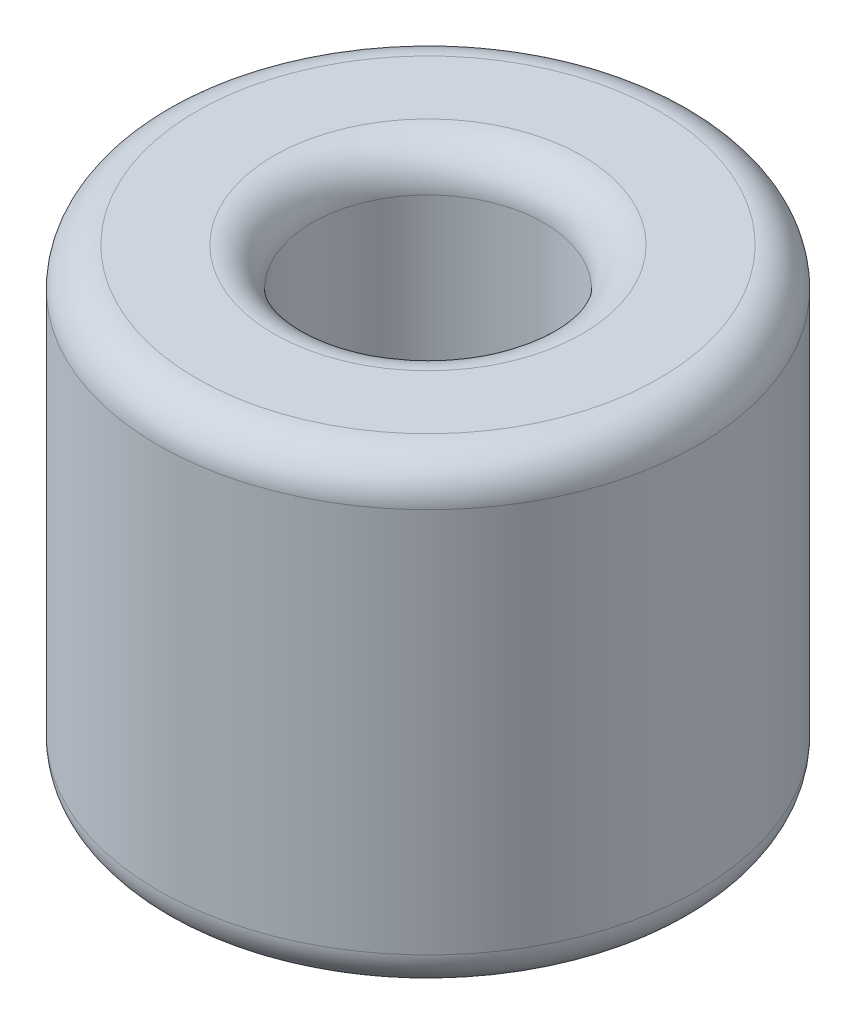
ISO-10303-21;
HEADER;
FILE_DESCRIPTION(('STEP AP214'),'2;1');
FILE_NAME('part.step','',(''),(''),'','','');
FILE_SCHEMA(('AUTOMOTIVE_DESIGN { 1 0 10303 214 1 1 1 1 }'));
ENDSEC;
DATA;
#1=APPLICATION_CONTEXT('core data for automotive mechanical design processes');
#2=APPLICATION_PROTOCOL_DEFINITION('international standard','automotive_design',2000,#1);
#3=PRODUCT_CONTEXT('',#1,'mechanical');
#4=PRODUCT('Part','Part','',(#3));
#5=PRODUCT_RELATED_PRODUCT_CATEGORY('part','',(#4));
#6=PRODUCT_DEFINITION_FORMATION('','',#4);
#7=PRODUCT_DEFINITION_CONTEXT('part definition',#1,'design');
#8=PRODUCT_DEFINITION('design','',#6,#7);
#9=PRODUCT_DEFINITION_SHAPE('','',#8);
#10=(LENGTH_UNIT() NAMED_UNIT(*) SI_UNIT(.MILLI.,.METRE.));
#11=(NAMED_UNIT(*) PLANE_ANGLE_UNIT() SI_UNIT($,.RADIAN.));
#12=(NAMED_UNIT(*) SI_UNIT($,.STERADIAN.) SOLID_ANGLE_UNIT());
#13=UNCERTAINTY_MEASURE_WITH_UNIT(LENGTH_MEASURE(1.E-05),#10,'distance_accuracy_value','');
#14=(GEOMETRIC_REPRESENTATION_CONTEXT(3) GLOBAL_UNCERTAINTY_ASSIGNED_CONTEXT((#13)) GLOBAL_UNIT_ASSIGNED_CONTEXT((#10,
#11,#12)) REPRESENTATION_CONTEXT('',''));
#15=CARTESIAN_POINT('',(0.,0.,0.));
#16=DIRECTION('',(0.,0.,1.));
#17=DIRECTION('',(1.,0.,0.));
#18=AXIS2_PLACEMENT_3D('',#15,#16,#17);
#19=CARTESIAN_POINT('',(0.,6.,0.));
#20=DIRECTION('',(0.,1.,0.));
#21=DIRECTION('',(0.,0.,1.));
#22=AXIS2_PLACEMENT_3D('',#19,#20,#21);
#23=PLANE('',#22);
#24=CARTESIAN_POINT('',(0.,6.,0.));
#25=DIRECTION('',(0.,1.,0.));
#26=DIRECTION('',(0.,0.,1.));
#27=AXIS2_PLACEMENT_3D('',#24,#25,#26);
#28=CIRCLE('',#27,2.);
#29=CARTESIAN_POINT('',(0.,6.,2.));
#30=VERTEX_POINT('',#29);
#31=EDGE_CURVE('E10',#30,#30,#28,.F.);
#32=ORIENTED_EDGE('',*,*,#31,.T.);
#33=EDGE_LOOP('',(#32));
#34=FACE_BOUND('',#33,.T.);
#35=CARTESIAN_POINT('',(0.,6.,0.));
#36=DIRECTION('',(0.,1.,0.));
#37=DIRECTION('',(0.,0.,1.));
#38=AXIS2_PLACEMENT_3D('',#35,#36,#37);
#39=CIRCLE('',#38,3.);
#40=CARTESIAN_POINT('',(0.,6.,3.));
#41=VERTEX_POINT('',#40);
#42=EDGE_CURVE('E43',#41,#41,#39,.T.);
#43=ORIENTED_EDGE('',*,*,#42,.T.);
#44=EDGE_LOOP('',(#43));
#45=FACE_BOUND('',#44,.T.);
#46=ADVANCED_FACE('F36',(#34,#45),#23,.T.);
#47=CARTESIAN_POINT('',(0.,0.,0.));
#48=DIRECTION('',(0.,1.,0.));
#49=DIRECTION('',(0.,0.,1.));
#50=AXIS2_PLACEMENT_3D('',#47,#48,#49);
#51=PLANE('',#50);
#52=CARTESIAN_POINT('',(0.,0.,0.));
#53=DIRECTION('',(0.,1.,0.));
#54=DIRECTION('',(0.,0.,1.));
#55=AXIS2_PLACEMENT_3D('',#52,#53,#54);
#56=CIRCLE('',#55,2.);
#57=CARTESIAN_POINT('',(0.,0.,2.));
#58=VERTEX_POINT('',#57);
#59=EDGE_CURVE('E62',#58,#58,#56,.T.);
#60=ORIENTED_EDGE('',*,*,#59,.T.);
#61=EDGE_LOOP('',(#60));
#62=FACE_BOUND('',#61,.T.);
#63=CARTESIAN_POINT('',(0.,0.,0.));
#64=DIRECTION('',(0.,1.,0.));
#65=DIRECTION('',(0.,0.,1.));
#66=AXIS2_PLACEMENT_3D('',#63,#64,#65);
#67=CIRCLE('',#66,3.);
#68=CARTESIAN_POINT('',(0.,0.,3.));
#69=VERTEX_POINT('',#68);
#70=EDGE_CURVE('E65',#69,#69,#67,.F.);
#71=ORIENTED_EDGE('',*,*,#70,.T.);
#72=EDGE_LOOP('',(#71));
#73=FACE_BOUND('',#72,.T.);
#74=ADVANCED_FACE('F69',(#62,#73),#51,.F.);
#75=CARTESIAN_POINT('',(0.,6.,0.));
#76=DIRECTION('',(0.,-1.,0.));
#77=DIRECTION('',(0.,0.,-1.));
#78=AXIS2_PLACEMENT_3D('',#75,#76,#77);
#79=CYLINDRICAL_SURFACE('',#78,3.5);
#80=CARTESIAN_POINT('',(0.,0.5,0.));
#81=DIRECTION('',(0.,1.,0.));
#82=DIRECTION('',(0.,0.,1.));
#83=AXIS2_PLACEMENT_3D('',#80,#81,#82);
#84=CIRCLE('',#83,3.5);
#85=CARTESIAN_POINT('',(0.,0.5,3.5));
#86=VERTEX_POINT('',#85);
#87=EDGE_CURVE('E47',#86,#86,#84,.T.);
#88=ORIENTED_EDGE('',*,*,#87,.T.);
#89=EDGE_LOOP('',(#88));
#90=FACE_BOUND('',#89,.T.);
#91=CARTESIAN_POINT('',(0.,5.5,0.));
#92=DIRECTION('',(0.,1.,0.));
#93=DIRECTION('',(0.,0.,1.));
#94=AXIS2_PLACEMENT_3D('',#91,#92,#93);
#95=CIRCLE('',#94,3.5);
#96=CARTESIAN_POINT('',(0.,5.5,3.5));
#97=VERTEX_POINT('',#96);
#98=EDGE_CURVE('E51',#97,#97,#95,.F.);
#99=ORIENTED_EDGE('',*,*,#98,.T.);
#100=EDGE_LOOP('',(#99));
#101=FACE_BOUND('',#100,.T.);
#102=ADVANCED_FACE('F79',(#90,#101),#79,.T.);
#103=CARTESIAN_POINT('',(0.,6.,0.));
#104=DIRECTION('',(0.,-1.,0.));
#105=DIRECTION('',(0.,0.,-1.));
#106=AXIS2_PLACEMENT_3D('',#103,#104,#105);
#107=CYLINDRICAL_SURFACE('',#106,1.5);
#108=CARTESIAN_POINT('',(0.,0.5,0.));
#109=DIRECTION('',(0.,1.,0.));
#110=DIRECTION('',(0.,0.,1.));
#111=AXIS2_PLACEMENT_3D('',#108,#109,#110);
#112=CIRCLE('',#111,1.5);
#113=CARTESIAN_POINT('',(0.,0.5,1.5));
#114=VERTEX_POINT('',#113);
#115=EDGE_CURVE('E56',#114,#114,#112,.F.);
#116=ORIENTED_EDGE('',*,*,#115,.T.);
#117=EDGE_LOOP('',(#116));
#118=FACE_BOUND('',#117,.T.);
#119=CARTESIAN_POINT('',(0.,5.5,0.));
#120=DIRECTION('',(0.,1.,0.));
#121=DIRECTION('',(0.,0.,1.));
#122=AXIS2_PLACEMENT_3D('',#119,#120,#121);
#123=CIRCLE('',#122,1.5);
#124=CARTESIAN_POINT('',(0.,5.5,1.5));
#125=VERTEX_POINT('',#124);
#126=EDGE_CURVE('E59',#125,#125,#123,.T.);
#127=ORIENTED_EDGE('',*,*,#126,.T.);
#128=EDGE_LOOP('',(#127));
#129=FACE_BOUND('',#128,.T.);
#130=ADVANCED_FACE('F82',(#118,#129),#107,.F.);
#131=CARTESIAN_POINT('',(0.,0.5,0.));
#132=DIRECTION('',(0.,1.,0.));
#133=DIRECTION('',(0.,0.,1.));
#134=AXIS2_PLACEMENT_3D('',#131,#132,#133);
#135=TOROIDAL_SURFACE('',#134,2.,0.5);
#136=ORIENTED_EDGE('',*,*,#115,.F.);
#137=EDGE_LOOP('',(#136));
#138=FACE_BOUND('',#137,.T.);
#139=ORIENTED_EDGE('',*,*,#59,.F.);
#140=EDGE_LOOP('',(#139));
#141=FACE_BOUND('',#140,.T.);
#142=ADVANCED_FACE('F75',(#138,#141),#135,.T.);
#143=CARTESIAN_POINT('',(0.,0.5,0.));
#144=DIRECTION('',(0.,1.,0.));
#145=DIRECTION('',(0.,0.,1.));
#146=AXIS2_PLACEMENT_3D('',#143,#144,#145);
#147=TOROIDAL_SURFACE('',#146,3.,0.5);
#148=ORIENTED_EDGE('',*,*,#70,.F.);
#149=EDGE_LOOP('',(#148));
#150=FACE_BOUND('',#149,.T.);
#151=ORIENTED_EDGE('',*,*,#87,.F.);
#152=EDGE_LOOP('',(#151));
#153=FACE_BOUND('',#152,.T.);
#154=ADVANCED_FACE('F71',(#150,#153),#147,.T.);
#155=CARTESIAN_POINT('',(0.,5.5,0.));
#156=DIRECTION('',(0.,1.,0.));
#157=DIRECTION('',(0.,0.,1.));
#158=AXIS2_PLACEMENT_3D('',#155,#156,#157);
#159=TOROIDAL_SURFACE('',#158,2.,0.5);
#160=ORIENTED_EDGE('',*,*,#31,.F.);
#161=EDGE_LOOP('',(#160));
#162=FACE_BOUND('',#161,.T.);
#163=ORIENTED_EDGE('',*,*,#126,.F.);
#164=EDGE_LOOP('',(#163));
#165=FACE_BOUND('',#164,.T.);
#166=ADVANCED_FACE('F74',(#162,#165),#159,.T.);
#167=CARTESIAN_POINT('',(0.,5.5,0.));
#168=DIRECTION('',(0.,1.,0.));
#169=DIRECTION('',(0.,0.,1.));
#170=AXIS2_PLACEMENT_3D('',#167,#168,#169);
#171=TOROIDAL_SURFACE('',#170,3.,0.5);
#172=ORIENTED_EDGE('',*,*,#98,.F.);
#173=EDGE_LOOP('',(#172));
#174=FACE_BOUND('',#173,.T.);
#175=ORIENTED_EDGE('',*,*,#42,.F.);
#176=EDGE_LOOP('',(#175));
#177=FACE_BOUND('',#176,.T.);
#178=ADVANCED_FACE('F38',(#174,#177),#171,.T.);
#179=CLOSED_SHELL('',(#46,#74,#102,#130,#142,#154,#166,#178));
#180=MANIFOLD_SOLID_BREP('B2',#179);
#181=ADVANCED_BREP_SHAPE_REPRESENTATION('',(#18,#180),#14);
#182=SHAPE_DEFINITION_REPRESENTATION(#9,#181);
ENDSEC;
END-ISO-10303-21;
